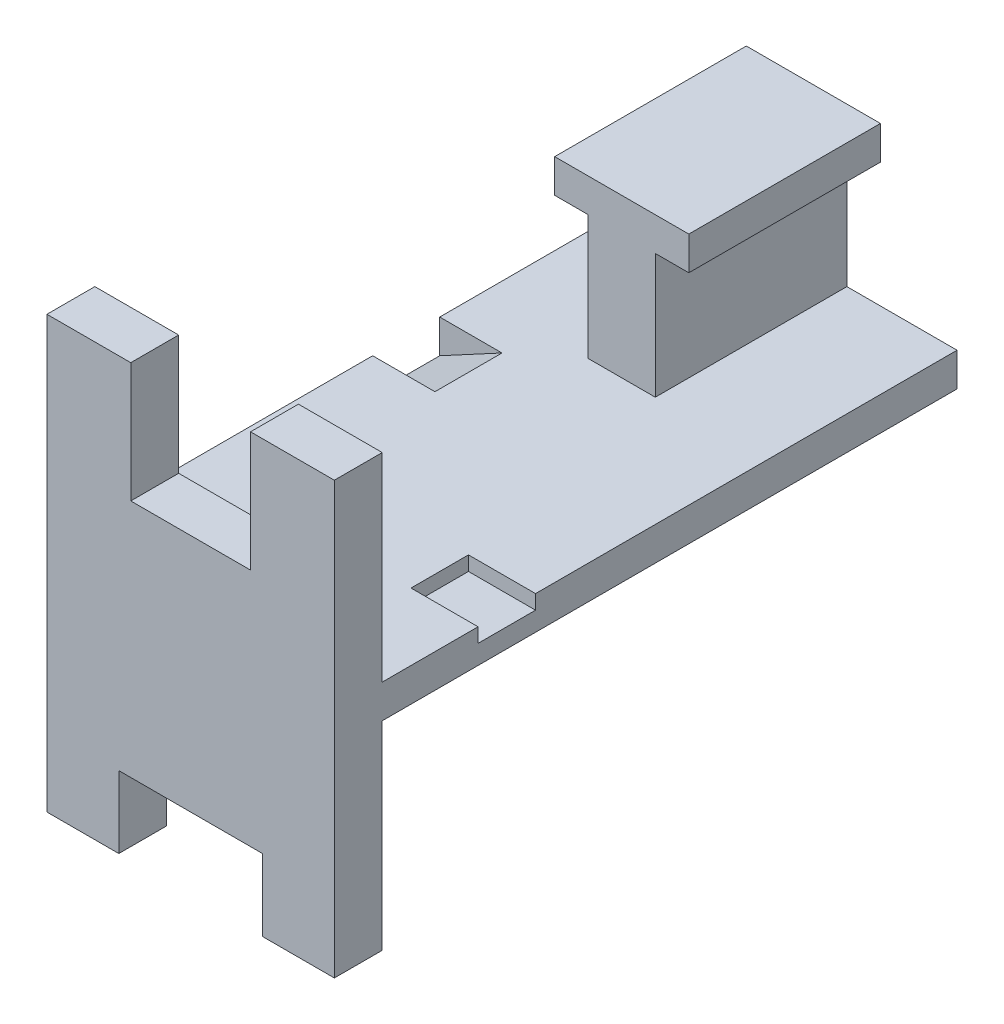
ISO-10303-21;
HEADER;
FILE_DESCRIPTION(('STEP AP214'),'2;1');
FILE_NAME('part.step','',(''),(''),'','','');
FILE_SCHEMA(('AUTOMOTIVE_DESIGN { 1 0 10303 214 1 1 1 1 }'));
ENDSEC;
DATA;
#1=APPLICATION_CONTEXT('core data for automotive mechanical design processes');
#2=APPLICATION_PROTOCOL_DEFINITION('international standard','automotive_design',2000,#1);
#3=PRODUCT_CONTEXT('',#1,'mechanical');
#4=PRODUCT('Part','Part','',(#3));
#5=PRODUCT_RELATED_PRODUCT_CATEGORY('part','',(#4));
#6=PRODUCT_DEFINITION_FORMATION('','',#4);
#7=PRODUCT_DEFINITION_CONTEXT('part definition',#1,'design');
#8=PRODUCT_DEFINITION('design','',#6,#7);
#9=PRODUCT_DEFINITION_SHAPE('','',#8);
#10=(LENGTH_UNIT() NAMED_UNIT(*) SI_UNIT(.MILLI.,.METRE.));
#11=(NAMED_UNIT(*) PLANE_ANGLE_UNIT() SI_UNIT($,.RADIAN.));
#12=(NAMED_UNIT(*) SI_UNIT($,.STERADIAN.) SOLID_ANGLE_UNIT());
#13=UNCERTAINTY_MEASURE_WITH_UNIT(LENGTH_MEASURE(1.E-05),#10,'distance_accuracy_value','');
#14=(GEOMETRIC_REPRESENTATION_CONTEXT(3) GLOBAL_UNCERTAINTY_ASSIGNED_CONTEXT((#13)) GLOBAL_UNIT_ASSIGNED_CONTEXT((#10,
#11,#12)) REPRESENTATION_CONTEXT('',''));
#15=CARTESIAN_POINT('',(0.,0.,0.));
#16=DIRECTION('',(0.,0.,1.));
#17=DIRECTION('',(1.,0.,0.));
#18=AXIS2_PLACEMENT_3D('',#15,#16,#17);
#19=CARTESIAN_POINT('',(0.,7.,120.));
#20=DIRECTION('',(0.,1.,0.));
#21=DIRECTION('',(0.,0.,1.));
#22=AXIS2_PLACEMENT_3D('',#19,#20,#21);
#23=PLANE('',#22);
#24=DIRECTION('',(0.,0.,-1.));
#25=VECTOR('',#24,1.);
#26=CARTESIAN_POINT('',(-17.,7.,62.));
#27=LINE('',#26,#25);
#28=CARTESIAN_POINT('',(-17.,7.,62.));
#29=VERTEX_POINT('',#28);
#30=CARTESIAN_POINT('',(-17.,7.,48.));
#31=VERTEX_POINT('',#30);
#32=EDGE_CURVE('E260',#29,#31,#27,.T.);
#33=ORIENTED_EDGE('',*,*,#32,.F.);
#34=DIRECTION('',(1.,0.,0.));
#35=VECTOR('',#34,1.);
#36=CARTESIAN_POINT('',(-17.,7.,62.));
#37=LINE('',#36,#35);
#38=CARTESIAN_POINT('',(-30.,6.99999999999999,62.));
#39=VERTEX_POINT('',#38);
#40=EDGE_CURVE('E247',#39,#29,#37,.T.);
#41=ORIENTED_EDGE('',*,*,#40,.F.);
#42=DIRECTION('',(0.,0.,-1.));
#43=VECTOR('',#42,1.);
#44=CARTESIAN_POINT('',(-30.,6.99999999999999,120.));
#45=LINE('',#44,#43);
#46=CARTESIAN_POINT('',(-30.,6.99999999999999,120.));
#47=VERTEX_POINT('',#46);
#48=EDGE_CURVE('E258',#47,#39,#45,.T.);
#49=ORIENTED_EDGE('',*,*,#48,.F.);
#50=DIRECTION('',(1.,0.,0.));
#51=VECTOR('',#50,1.);
#52=CARTESIAN_POINT('',(0.,7.,120.));
#53=LINE('',#52,#51);
#54=CARTESIAN_POINT('',(30.,7.,120.));
#55=VERTEX_POINT('',#54);
#56=EDGE_CURVE('E319',#47,#55,#53,.T.);
#57=ORIENTED_EDGE('',*,*,#56,.T.);
#58=DIRECTION('',(0.,0.,-1.));
#59=VECTOR('',#58,1.);
#60=CARTESIAN_POINT('',(30.,7.,120.));
#61=LINE('',#60,#59);
#62=CARTESIAN_POINT('',(30.,7.,100.));
#63=VERTEX_POINT('',#62);
#64=EDGE_CURVE('E276',#55,#63,#61,.T.);
#65=ORIENTED_EDGE('',*,*,#64,.T.);
#66=DIRECTION('',(1.,0.,0.));
#67=VECTOR('',#66,1.);
#68=CARTESIAN_POINT('',(30.,7.,100.));
#69=LINE('',#68,#67);
#70=CARTESIAN_POINT('',(16.,7.,100.));
#71=VERTEX_POINT('',#70);
#72=EDGE_CURVE('E717',#71,#63,#69,.T.);
#73=ORIENTED_EDGE('',*,*,#72,.F.);
#74=DIRECTION('',(0.,0.,1.));
#75=VECTOR('',#74,1.);
#76=CARTESIAN_POINT('',(16.,7.,100.));
#77=LINE('',#76,#75);
#78=CARTESIAN_POINT('',(16.,7.,88.));
#79=VERTEX_POINT('',#78);
#80=EDGE_CURVE('E720',#79,#71,#77,.T.);
#81=ORIENTED_EDGE('',*,*,#80,.F.);
#82=DIRECTION('',(-1.,0.,0.));
#83=VECTOR('',#82,1.);
#84=CARTESIAN_POINT('',(30.,7.,88.));
#85=LINE('',#84,#83);
#86=CARTESIAN_POINT('',(30.,7.,88.));
#87=VERTEX_POINT('',#86);
#88=EDGE_CURVE('E723',#87,#79,#85,.T.);
#89=ORIENTED_EDGE('',*,*,#88,.F.);
#90=CARTESIAN_POINT('',(30.,7.,0.));
#91=VERTEX_POINT('',#90);
#92=EDGE_CURVE('E281',#87,#91,#61,.T.);
#93=ORIENTED_EDGE('',*,*,#92,.T.);
#94=DIRECTION('',(1.,0.,0.));
#95=VECTOR('',#94,1.);
#96=CARTESIAN_POINT('',(0.,7.,0.));
#97=LINE('',#96,#95);
#98=CARTESIAN_POINT('',(7.,7.,0.));
#99=VERTEX_POINT('',#98);
#100=EDGE_CURVE('E342',#99,#91,#97,.T.);
#101=ORIENTED_EDGE('',*,*,#100,.F.);
#102=DIRECTION('',(0.,0.,-1.));
#103=VECTOR('',#102,1.);
#104=CARTESIAN_POINT('',(7.,7.,120.));
#105=LINE('',#104,#103);
#106=CARTESIAN_POINT('',(7.,7.00000000000001,40.));
#107=VERTEX_POINT('',#106);
#108=EDGE_CURVE('E285',#107,#99,#105,.T.);
#109=ORIENTED_EDGE('',*,*,#108,.F.);
#110=DIRECTION('',(1.,0.,0.));
#111=VECTOR('',#110,1.);
#112=CARTESIAN_POINT('',(0.,7.00000000000001,40.));
#113=LINE('',#112,#111);
#114=CARTESIAN_POINT('',(-7.,7.,40.));
#115=VERTEX_POINT('',#114);
#116=EDGE_CURVE('E304',#115,#107,#113,.T.);
#117=ORIENTED_EDGE('',*,*,#116,.F.);
#118=DIRECTION('',(0.,0.,-1.));
#119=VECTOR('',#118,1.);
#120=CARTESIAN_POINT('',(-7.,7.,120.));
#121=LINE('',#120,#119);
#122=CARTESIAN_POINT('',(-7.,7.,0.));
#123=VERTEX_POINT('',#122);
#124=EDGE_CURVE('E266',#115,#123,#121,.T.);
#125=ORIENTED_EDGE('',*,*,#124,.T.);
#126=DIRECTION('',(-1.,0.,0.));
#127=VECTOR('',#126,1.);
#128=CARTESIAN_POINT('',(0.,7.,0.));
#129=LINE('',#128,#127);
#130=CARTESIAN_POINT('',(-30.,6.99999999999999,0.));
#131=VERTEX_POINT('',#130);
#132=EDGE_CURVE('E468',#123,#131,#129,.T.);
#133=ORIENTED_EDGE('',*,*,#132,.T.);
#134=CARTESIAN_POINT('',(-30.,6.99999999999999,48.));
#135=VERTEX_POINT('',#134);
#136=EDGE_CURVE('E40',#135,#131,#45,.T.);
#137=ORIENTED_EDGE('',*,*,#136,.F.);
#138=DIRECTION('',(1.,0.,0.));
#139=VECTOR('',#138,1.);
#140=CARTESIAN_POINT('',(-17.,7.,48.));
#141=LINE('',#140,#139);
#142=EDGE_CURVE('E54',#135,#31,#141,.T.);
#143=ORIENTED_EDGE('',*,*,#142,.T.);
#144=EDGE_LOOP('',(#33,#41,#49,#57,#65,#73,#81,#89,#93,#101,#109,#117,#125,#133,#137,#143));
#145=FACE_BOUND('',#144,.T.);
#146=ADVANCED_FACE('F36',(#145),#23,.T.);
#147=CARTESIAN_POINT('',(-30.,0.,120.));
#148=DIRECTION('',(-1.,0.,0.));
#149=DIRECTION('',(0.,-1.,0.));
#150=AXIS2_PLACEMENT_3D('',#147,#148,#149);
#151=PLANE('',#150);
#152=ORIENTED_EDGE('',*,*,#48,.T.);
#153=DIRECTION('',(0.,1.,0.));
#154=VECTOR('',#153,1.);
#155=CARTESIAN_POINT('',(-30.,6.99999999999999,62.));
#156=LINE('',#155,#154);
#157=CARTESIAN_POINT('',(-30.,0.,62.));
#158=VERTEX_POINT('',#157);
#159=EDGE_CURVE('E244',#158,#39,#156,.T.);
#160=ORIENTED_EDGE('',*,*,#159,.F.);
#161=DIRECTION('',(0.,0.,-1.));
#162=VECTOR('',#161,1.);
#163=CARTESIAN_POINT('',(-30.,0.,120.));
#164=LINE('',#163,#162);
#165=CARTESIAN_POINT('',(-30.,0.,120.));
#166=VERTEX_POINT('',#165);
#167=EDGE_CURVE('E270',#166,#158,#164,.T.);
#168=ORIENTED_EDGE('',*,*,#167,.F.);
#169=DIRECTION('',(0.,1.,0.));
#170=VECTOR('',#169,1.);
#171=CARTESIAN_POINT('',(-30.,0.,120.));
#172=LINE('',#171,#170);
#173=CARTESIAN_POINT('',(-30.,-41.5,120.));
#174=VERTEX_POINT('',#173);
#175=EDGE_CURVE('E397',#174,#166,#172,.T.);
#176=ORIENTED_EDGE('',*,*,#175,.F.);
#177=DIRECTION('',(0.,0.,-1.));
#178=VECTOR('',#177,1.);
#179=CARTESIAN_POINT('',(-30.,-41.5,130.));
#180=LINE('',#179,#178);
#181=CARTESIAN_POINT('',(-30.,-41.5,130.));
#182=VERTEX_POINT('',#181);
#183=EDGE_CURVE('E425',#182,#174,#180,.T.);
#184=ORIENTED_EDGE('',*,*,#183,.F.);
#185=DIRECTION('',(0.,1.,0.));
#186=VECTOR('',#185,1.);
#187=CARTESIAN_POINT('',(-30.,0.,130.));
#188=LINE('',#187,#186);
#189=CARTESIAN_POINT('',(-30.,48.5,130.));
#190=VERTEX_POINT('',#189);
#191=EDGE_CURVE('E693',#182,#190,#188,.T.);
#192=ORIENTED_EDGE('',*,*,#191,.T.);
#193=DIRECTION('',(0.,0.,-1.));
#194=VECTOR('',#193,1.);
#195=CARTESIAN_POINT('',(-30.,48.5,130.));
#196=LINE('',#195,#194);
#197=CARTESIAN_POINT('',(-30.,48.5,120.));
#198=VERTEX_POINT('',#197);
#199=EDGE_CURVE('E427',#190,#198,#196,.T.);
#200=ORIENTED_EDGE('',*,*,#199,.T.);
#201=EDGE_CURVE('E265',#47,#198,#172,.T.);
#202=ORIENTED_EDGE('',*,*,#201,.F.);
#203=EDGE_LOOP('',(#152,#160,#168,#176,#184,#192,#200,#202));
#204=FACE_BOUND('',#203,.T.);
#205=ADVANCED_FACE('F263',(#204),#151,.T.);
#206=CARTESIAN_POINT('',(0.,40.,120.));
#207=DIRECTION('',(0.,1.,0.));
#208=DIRECTION('',(0.,0.,1.));
#209=AXIS2_PLACEMENT_3D('',#206,#207,#208);
#210=PLANE('',#209);
#211=DIRECTION('',(0.,0.,-1.));
#212=VECTOR('',#211,1.);
#213=CARTESIAN_POINT('',(-14.,40.,120.));
#214=LINE('',#213,#212);
#215=CARTESIAN_POINT('',(-14.,40.,40.));
#216=VERTEX_POINT('',#215);
#217=CARTESIAN_POINT('',(-14.,40.,0.));
#218=VERTEX_POINT('',#217);
#219=EDGE_CURVE('E287',#216,#218,#214,.T.);
#220=ORIENTED_EDGE('',*,*,#219,.F.);
#221=DIRECTION('',(-1.,0.,0.));
#222=VECTOR('',#221,1.);
#223=CARTESIAN_POINT('',(0.,40.,40.));
#224=LINE('',#223,#222);
#225=CARTESIAN_POINT('',(14.,40.,40.));
#226=VERTEX_POINT('',#225);
#227=EDGE_CURVE('E303',#226,#216,#224,.T.);
#228=ORIENTED_EDGE('',*,*,#227,.F.);
#229=DIRECTION('',(0.,0.,-1.));
#230=VECTOR('',#229,1.);
#231=CARTESIAN_POINT('',(14.,40.,120.));
#232=LINE('',#231,#230);
#233=CARTESIAN_POINT('',(14.,40.,0.));
#234=VERTEX_POINT('',#233);
#235=EDGE_CURVE('E324',#226,#234,#232,.T.);
#236=ORIENTED_EDGE('',*,*,#235,.T.);
#237=DIRECTION('',(1.,0.,0.));
#238=VECTOR('',#237,1.);
#239=CARTESIAN_POINT('',(0.,40.,0.));
#240=LINE('',#239,#238);
#241=EDGE_CURVE('E350',#218,#234,#240,.T.);
#242=ORIENTED_EDGE('',*,*,#241,.F.);
#243=EDGE_LOOP('',(#220,#228,#236,#242));
#244=FACE_BOUND('',#243,.T.);
#245=ADVANCED_FACE('F369',(#244),#210,.T.);
#246=CARTESIAN_POINT('',(0.,33.,120.));
#247=DIRECTION('',(0.,-1.,0.));
#248=DIRECTION('',(1.,0.,0.));
#249=AXIS2_PLACEMENT_3D('',#246,#247,#248);
#250=PLANE('',#249);
#251=DIRECTION('',(0.,0.,-1.));
#252=VECTOR('',#251,1.);
#253=CARTESIAN_POINT('',(-7.00000000000001,33.,120.));
#254=LINE('',#253,#252);
#255=CARTESIAN_POINT('',(-7.00000000000001,33.,40.));
#256=VERTEX_POINT('',#255);
#257=CARTESIAN_POINT('',(-7.00000000000001,33.,0.));
#258=VERTEX_POINT('',#257);
#259=EDGE_CURVE('E268',#256,#258,#254,.T.);
#260=ORIENTED_EDGE('',*,*,#259,.F.);
#261=DIRECTION('',(-1.,0.,0.));
#262=VECTOR('',#261,1.);
#263=CARTESIAN_POINT('',(0.,33.,40.));
#264=LINE('',#263,#262);
#265=CARTESIAN_POINT('',(-14.,33.,40.));
#266=VERTEX_POINT('',#265);
#267=EDGE_CURVE('E452',#256,#266,#264,.T.);
#268=ORIENTED_EDGE('',*,*,#267,.T.);
#269=DIRECTION('',(0.,0.,-1.));
#270=VECTOR('',#269,1.);
#271=CARTESIAN_POINT('',(-14.,33.,120.));
#272=LINE('',#271,#270);
#273=CARTESIAN_POINT('',(-14.,33.,0.));
#274=VERTEX_POINT('',#273);
#275=EDGE_CURVE('E292',#266,#274,#272,.T.);
#276=ORIENTED_EDGE('',*,*,#275,.T.);
#277=DIRECTION('',(-1.,0.,0.));
#278=VECTOR('',#277,1.);
#279=CARTESIAN_POINT('',(0.,33.,0.));
#280=LINE('',#279,#278);
#281=EDGE_CURVE('E458',#258,#274,#280,.T.);
#282=ORIENTED_EDGE('',*,*,#281,.F.);
#283=EDGE_LOOP('',(#260,#268,#276,#282));
#284=FACE_BOUND('',#283,.T.);
#285=ADVANCED_FACE('F483',(#284),#250,.T.);
#286=CARTESIAN_POINT('',(-7.,0.,120.));
#287=DIRECTION('',(-1.,0.,0.));
#288=DIRECTION('',(0.,-1.,0.));
#289=AXIS2_PLACEMENT_3D('',#286,#287,#288);
#290=PLANE('',#289);
#291=ORIENTED_EDGE('',*,*,#124,.F.);
#292=DIRECTION('',(0.,1.,0.));
#293=VECTOR('',#292,1.);
#294=CARTESIAN_POINT('',(-7.,0.,40.));
#295=LINE('',#294,#293);
#296=EDGE_CURVE('E447',#115,#256,#295,.T.);
#297=ORIENTED_EDGE('',*,*,#296,.T.);
#298=ORIENTED_EDGE('',*,*,#259,.T.);
#299=DIRECTION('',(0.,1.,0.));
#300=VECTOR('',#299,1.);
#301=CARTESIAN_POINT('',(-7.,0.,0.));
#302=LINE('',#301,#300);
#303=EDGE_CURVE('E465',#123,#258,#302,.T.);
#304=ORIENTED_EDGE('',*,*,#303,.F.);
#305=EDGE_LOOP('',(#291,#297,#298,#304));
#306=FACE_BOUND('',#305,.T.);
#307=ADVANCED_FACE('F478',(#306),#290,.T.);
#308=CARTESIAN_POINT('',(-14.,0.,120.));
#309=DIRECTION('',(-1.,0.,0.));
#310=DIRECTION('',(0.,-1.,0.));
#311=AXIS2_PLACEMENT_3D('',#308,#309,#310);
#312=PLANE('',#311);
#313=ORIENTED_EDGE('',*,*,#275,.F.);
#314=DIRECTION('',(0.,1.,0.));
#315=VECTOR('',#314,1.);
#316=CARTESIAN_POINT('',(-14.,0.,40.));
#317=LINE('',#316,#315);
#318=EDGE_CURVE('E11',#266,#216,#317,.T.);
#319=ORIENTED_EDGE('',*,*,#318,.T.);
#320=ORIENTED_EDGE('',*,*,#219,.T.);
#321=DIRECTION('',(0.,1.,0.));
#322=VECTOR('',#321,1.);
#323=CARTESIAN_POINT('',(-14.,0.,0.));
#324=LINE('',#323,#322);
#325=EDGE_CURVE('E298',#274,#218,#324,.T.);
#326=ORIENTED_EDGE('',*,*,#325,.F.);
#327=EDGE_LOOP('',(#313,#319,#320,#326));
#328=FACE_BOUND('',#327,.T.);
#329=ADVANCED_FACE('F482',(#328),#312,.T.);
#330=CARTESIAN_POINT('',(0.,33.,120.));
#331=DIRECTION('',(0.,1.,0.));
#332=DIRECTION('',(0.,0.,1.));
#333=AXIS2_PLACEMENT_3D('',#330,#331,#332);
#334=PLANE('',#333);
#335=DIRECTION('',(0.,0.,-1.));
#336=VECTOR('',#335,1.);
#337=CARTESIAN_POINT('',(14.,33.,120.));
#338=LINE('',#337,#336);
#339=CARTESIAN_POINT('',(14.,33.,40.));
#340=VERTEX_POINT('',#339);
#341=CARTESIAN_POINT('',(14.,33.,0.));
#342=VERTEX_POINT('',#341);
#343=EDGE_CURVE('E335',#340,#342,#338,.T.);
#344=ORIENTED_EDGE('',*,*,#343,.F.);
#345=DIRECTION('',(-1.,0.,0.));
#346=VECTOR('',#345,1.);
#347=CARTESIAN_POINT('',(0.,33.,40.));
#348=LINE('',#347,#346);
#349=CARTESIAN_POINT('',(7.,33.,40.));
#350=VERTEX_POINT('',#349);
#351=EDGE_CURVE('E306',#340,#350,#348,.T.);
#352=ORIENTED_EDGE('',*,*,#351,.T.);
#353=DIRECTION('',(0.,0.,-1.));
#354=VECTOR('',#353,1.);
#355=CARTESIAN_POINT('',(7.,33.,120.));
#356=LINE('',#355,#354);
#357=CARTESIAN_POINT('',(7.,33.,0.));
#358=VERTEX_POINT('',#357);
#359=EDGE_CURVE('E332',#350,#358,#356,.T.);
#360=ORIENTED_EDGE('',*,*,#359,.T.);
#361=DIRECTION('',(1.,0.,0.));
#362=VECTOR('',#361,1.);
#363=CARTESIAN_POINT('',(0.,33.,0.));
#364=LINE('',#363,#362);
#365=EDGE_CURVE('E311',#358,#342,#364,.T.);
#366=ORIENTED_EDGE('',*,*,#365,.T.);
#367=EDGE_LOOP('',(#344,#352,#360,#366));
#368=FACE_BOUND('',#367,.T.);
#369=ADVANCED_FACE('F38',(#368),#334,.F.);
#370=CARTESIAN_POINT('',(14.,0.,120.));
#371=DIRECTION('',(-1.,0.,0.));
#372=DIRECTION('',(0.,0.,1.));
#373=AXIS2_PLACEMENT_3D('',#370,#371,#372);
#374=PLANE('',#373);
#375=ORIENTED_EDGE('',*,*,#235,.F.);
#376=DIRECTION('',(0.,1.,0.));
#377=VECTOR('',#376,1.);
#378=CARTESIAN_POINT('',(14.,-74.2157620169878,40.));
#379=LINE('',#378,#377);
#380=EDGE_CURVE('E307',#340,#226,#379,.T.);
#381=ORIENTED_EDGE('',*,*,#380,.F.);
#382=ORIENTED_EDGE('',*,*,#343,.T.);
#383=DIRECTION('',(0.,1.,0.));
#384=VECTOR('',#383,1.);
#385=CARTESIAN_POINT('',(14.,0.,0.));
#386=LINE('',#385,#384);
#387=EDGE_CURVE('E352',#342,#234,#386,.T.);
#388=ORIENTED_EDGE('',*,*,#387,.T.);
#389=EDGE_LOOP('',(#375,#381,#382,#388));
#390=FACE_BOUND('',#389,.T.);
#391=ADVANCED_FACE('F372',(#390),#374,.F.);
#392=CARTESIAN_POINT('',(0.,0.,120.));
#393=DIRECTION('',(0.,1.,0.));
#394=DIRECTION('',(0.,0.,1.));
#395=AXIS2_PLACEMENT_3D('',#392,#393,#394);
#396=PLANE('',#395);
#397=DIRECTION('',(1.,0.,0.));
#398=VECTOR('',#397,1.);
#399=CARTESIAN_POINT('',(0.,0.,0.));
#400=LINE('',#399,#398);
#401=CARTESIAN_POINT('',(-30.,0.,0.));
#402=VERTEX_POINT('',#401);
#403=CARTESIAN_POINT('',(30.,0.,0.));
#404=VERTEX_POINT('',#403);
#405=EDGE_CURVE('E348',#402,#404,#400,.T.);
#406=ORIENTED_EDGE('',*,*,#405,.T.);
#407=DIRECTION('',(0.,0.,-1.));
#408=VECTOR('',#407,1.);
#409=CARTESIAN_POINT('',(30.,0.,120.));
#410=LINE('',#409,#408);
#411=CARTESIAN_POINT('',(30.,0.,120.));
#412=VERTEX_POINT('',#411);
#413=EDGE_CURVE('E280',#412,#404,#410,.T.);
#414=ORIENTED_EDGE('',*,*,#413,.F.);
#415=DIRECTION('',(1.,0.,0.));
#416=VECTOR('',#415,1.);
#417=CARTESIAN_POINT('',(0.,0.,120.));
#418=LINE('',#417,#416);
#419=EDGE_CURVE('E316',#166,#412,#418,.T.);
#420=ORIENTED_EDGE('',*,*,#419,.F.);
#421=ORIENTED_EDGE('',*,*,#167,.T.);
#422=DIRECTION('',(0.,0.,-1.));
#423=VECTOR('',#422,1.);
#424=CARTESIAN_POINT('',(-30.,0.,62.));
#425=LINE('',#424,#423);
#426=CARTESIAN_POINT('',(-30.,0.,48.));
#427=VERTEX_POINT('',#426);
#428=EDGE_CURVE('E725',#158,#427,#425,.T.);
#429=ORIENTED_EDGE('',*,*,#428,.T.);
#430=EDGE_CURVE('E286',#427,#402,#164,.T.);
#431=ORIENTED_EDGE('',*,*,#430,.T.);
#432=EDGE_LOOP('',(#406,#414,#420,#421,#429,#431));
#433=FACE_BOUND('',#432,.T.);
#434=ADVANCED_FACE('F390',(#433),#396,.F.);
#435=CARTESIAN_POINT('',(30.,0.,120.));
#436=DIRECTION('',(-1.,0.,0.));
#437=DIRECTION('',(0.,-1.,0.));
#438=AXIS2_PLACEMENT_3D('',#435,#436,#437);
#439=PLANE('',#438);
#440=DIRECTION('',(0.,0.,-1.));
#441=VECTOR('',#440,1.);
#442=CARTESIAN_POINT('',(30.,4.,100.));
#443=LINE('',#442,#441);
#444=CARTESIAN_POINT('',(30.,4.,100.));
#445=VERTEX_POINT('',#444);
#446=CARTESIAN_POINT('',(30.,4.,88.));
#447=VERTEX_POINT('',#446);
#448=EDGE_CURVE('E719',#445,#447,#443,.T.);
#449=ORIENTED_EDGE('',*,*,#448,.F.);
#450=DIRECTION('',(0.,1.,0.));
#451=VECTOR('',#450,1.);
#452=CARTESIAN_POINT('',(30.,4.,100.));
#453=LINE('',#452,#451);
#454=EDGE_CURVE('E646',#445,#63,#453,.T.);
#455=ORIENTED_EDGE('',*,*,#454,.T.);
#456=ORIENTED_EDGE('',*,*,#64,.F.);
#457=DIRECTION('',(0.,1.,0.));
#458=VECTOR('',#457,1.);
#459=CARTESIAN_POINT('',(30.,0.,120.));
#460=LINE('',#459,#458);
#461=CARTESIAN_POINT('',(30.,48.5,120.));
#462=VERTEX_POINT('',#461);
#463=EDGE_CURVE('E461',#55,#462,#460,.T.);
#464=ORIENTED_EDGE('',*,*,#463,.T.);
#465=DIRECTION('',(0.,0.,-1.));
#466=VECTOR('',#465,1.);
#467=CARTESIAN_POINT('',(30.,48.5,130.));
#468=LINE('',#467,#466);
#469=CARTESIAN_POINT('',(30.,48.5,130.));
#470=VERTEX_POINT('',#469);
#471=EDGE_CURVE('E437',#470,#462,#468,.T.);
#472=ORIENTED_EDGE('',*,*,#471,.F.);
#473=DIRECTION('',(0.,1.,0.));
#474=VECTOR('',#473,1.);
#475=CARTESIAN_POINT('',(30.,0.,130.));
#476=LINE('',#475,#474);
#477=CARTESIAN_POINT('',(30.,-41.5,130.));
#478=VERTEX_POINT('',#477);
#479=EDGE_CURVE('E705',#478,#470,#476,.T.);
#480=ORIENTED_EDGE('',*,*,#479,.F.);
#481=DIRECTION('',(0.,0.,-1.));
#482=VECTOR('',#481,1.);
#483=CARTESIAN_POINT('',(30.,-41.5,130.));
#484=LINE('',#483,#482);
#485=CARTESIAN_POINT('',(30.,-41.5,120.));
#486=VERTEX_POINT('',#485);
#487=EDGE_CURVE('E440',#478,#486,#484,.T.);
#488=ORIENTED_EDGE('',*,*,#487,.T.);
#489=EDGE_CURVE('E389',#486,#412,#460,.T.);
#490=ORIENTED_EDGE('',*,*,#489,.T.);
#491=ORIENTED_EDGE('',*,*,#413,.T.);
#492=DIRECTION('',(0.,1.,0.));
#493=VECTOR('',#492,1.);
#494=CARTESIAN_POINT('',(30.,0.,0.));
#495=LINE('',#494,#493);
#496=EDGE_CURVE('E345',#404,#91,#495,.T.);
#497=ORIENTED_EDGE('',*,*,#496,.T.);
#498=ORIENTED_EDGE('',*,*,#92,.F.);
#499=DIRECTION('',(0.,1.,0.));
#500=VECTOR('',#499,1.);
#501=CARTESIAN_POINT('',(30.,4.,88.));
#502=LINE('',#501,#500);
#503=EDGE_CURVE('E62',#447,#87,#502,.T.);
#504=ORIENTED_EDGE('',*,*,#503,.F.);
#505=EDGE_LOOP('',(#449,#455,#456,#464,#472,#480,#488,#490,#491,#497,#498,#504));
#506=FACE_BOUND('',#505,.T.);
#507=ADVANCED_FACE('F385',(#506),#439,.F.);
#508=CARTESIAN_POINT('',(7.,0.,120.));
#509=DIRECTION('',(-1.,0.,0.));
#510=DIRECTION('',(0.,0.,1.));
#511=AXIS2_PLACEMENT_3D('',#508,#509,#510);
#512=PLANE('',#511);
#513=ORIENTED_EDGE('',*,*,#359,.F.);
#514=DIRECTION('',(0.,-1.,0.));
#515=VECTOR('',#514,1.);
#516=CARTESIAN_POINT('',(7.,0.,40.));
#517=LINE('',#516,#515);
#518=EDGE_CURVE('E46',#350,#107,#517,.T.);
#519=ORIENTED_EDGE('',*,*,#518,.T.);
#520=ORIENTED_EDGE('',*,*,#108,.T.);
#521=DIRECTION('',(0.,1.,0.));
#522=VECTOR('',#521,1.);
#523=CARTESIAN_POINT('',(7.,0.,0.));
#524=LINE('',#523,#522);
#525=EDGE_CURVE('E320',#99,#358,#524,.T.);
#526=ORIENTED_EDGE('',*,*,#525,.T.);
#527=EDGE_LOOP('',(#513,#519,#520,#526));
#528=FACE_BOUND('',#527,.T.);
#529=ADVANCED_FACE('F376',(#528),#512,.F.);
#530=CARTESIAN_POINT('',(0.,0.,0.));
#531=DIRECTION('',(0.,0.,1.));
#532=DIRECTION('',(1.,0.,0.));
#533=AXIS2_PLACEMENT_3D('',#530,#531,#532);
#534=PLANE('',#533);
#535=ORIENTED_EDGE('',*,*,#365,.F.);
#536=ORIENTED_EDGE('',*,*,#525,.F.);
#537=ORIENTED_EDGE('',*,*,#100,.T.);
#538=ORIENTED_EDGE('',*,*,#496,.F.);
#539=ORIENTED_EDGE('',*,*,#405,.F.);
#540=DIRECTION('',(0.,1.,0.));
#541=VECTOR('',#540,1.);
#542=CARTESIAN_POINT('',(-30.,0.,0.));
#543=LINE('',#542,#541);
#544=EDGE_CURVE('E471',#402,#131,#543,.T.);
#545=ORIENTED_EDGE('',*,*,#544,.T.);
#546=ORIENTED_EDGE('',*,*,#132,.F.);
#547=ORIENTED_EDGE('',*,*,#303,.T.);
#548=ORIENTED_EDGE('',*,*,#281,.T.);
#549=ORIENTED_EDGE('',*,*,#325,.T.);
#550=ORIENTED_EDGE('',*,*,#241,.T.);
#551=ORIENTED_EDGE('',*,*,#387,.F.);
#552=EDGE_LOOP('',(#535,#536,#537,#538,#539,#545,#546,#547,#548,#549,#550,#551));
#553=FACE_BOUND('',#552,.T.);
#554=ADVANCED_FACE('F364',(#553),#534,.F.);
#555=CARTESIAN_POINT('',(0.,-74.2157620169878,40.));
#556=DIRECTION('',(0.,0.,-1.));
#557=DIRECTION('',(-1.,0.,0.));
#558=AXIS2_PLACEMENT_3D('',#555,#556,#557);
#559=PLANE('',#558);
#560=ORIENTED_EDGE('',*,*,#380,.T.);
#561=ORIENTED_EDGE('',*,*,#227,.T.);
#562=ORIENTED_EDGE('',*,*,#318,.F.);
#563=ORIENTED_EDGE('',*,*,#267,.F.);
#564=ORIENTED_EDGE('',*,*,#296,.F.);
#565=ORIENTED_EDGE('',*,*,#116,.T.);
#566=ORIENTED_EDGE('',*,*,#518,.F.);
#567=ORIENTED_EDGE('',*,*,#351,.F.);
#568=EDGE_LOOP('',(#560,#561,#562,#563,#564,#565,#566,#567));
#569=FACE_BOUND('',#568,.T.);
#570=ADVANCED_FACE('F374',(#569),#559,.F.);
#571=DIRECTION('',(0.,1.,0.));
#572=VECTOR('',#571,1.);
#573=CARTESIAN_POINT('',(-30.,6.99999999999999,48.));
#574=LINE('',#573,#572);
#575=EDGE_CURVE('E477',#427,#135,#574,.T.);
#576=ORIENTED_EDGE('',*,*,#575,.T.);
#577=ORIENTED_EDGE('',*,*,#136,.T.);
#578=ORIENTED_EDGE('',*,*,#544,.F.);
#579=ORIENTED_EDGE('',*,*,#430,.F.);
#580=EDGE_LOOP('',(#576,#577,#578,#579));
#581=FACE_BOUND('',#580,.T.);
#582=ADVANCED_FACE('F475',(#581),#151,.T.);
#583=CARTESIAN_POINT('',(0.,0.,120.));
#584=DIRECTION('',(0.,0.,1.));
#585=DIRECTION('',(1.,0.,0.));
#586=AXIS2_PLACEMENT_3D('',#583,#584,#585);
#587=PLANE('',#586);
#588=ORIENTED_EDGE('',*,*,#175,.T.);
#589=ORIENTED_EDGE('',*,*,#419,.T.);
#590=ORIENTED_EDGE('',*,*,#489,.F.);
#591=DIRECTION('',(1.,0.,0.));
#592=VECTOR('',#591,1.);
#593=CARTESIAN_POINT('',(0.,-41.5,120.));
#594=LINE('',#593,#592);
#595=CARTESIAN_POINT('',(15.,-41.5,120.));
#596=VERTEX_POINT('',#595);
#597=EDGE_CURVE('E404',#596,#486,#594,.T.);
#598=ORIENTED_EDGE('',*,*,#597,.F.);
#599=DIRECTION('',(0.,-1.,0.));
#600=VECTOR('',#599,1.);
#601=CARTESIAN_POINT('',(15.,0.,120.));
#602=LINE('',#601,#600);
#603=CARTESIAN_POINT('',(15.,-26.5,120.));
#604=VERTEX_POINT('',#603);
#605=EDGE_CURVE('E642',#604,#596,#602,.T.);
#606=ORIENTED_EDGE('',*,*,#605,.F.);
#607=DIRECTION('',(1.,0.,0.));
#608=VECTOR('',#607,1.);
#609=CARTESIAN_POINT('',(0.,-26.5,120.));
#610=LINE('',#609,#608);
#611=CARTESIAN_POINT('',(-15.,-26.5,120.));
#612=VERTEX_POINT('',#611);
#613=EDGE_CURVE('E644',#612,#604,#610,.T.);
#614=ORIENTED_EDGE('',*,*,#613,.F.);
#615=DIRECTION('',(0.,-1.,0.));
#616=VECTOR('',#615,1.);
#617=CARTESIAN_POINT('',(-15.,0.,120.));
#618=LINE('',#617,#616);
#619=CARTESIAN_POINT('',(-15.,-41.5,120.));
#620=VERTEX_POINT('',#619);
#621=EDGE_CURVE('E402',#612,#620,#618,.T.);
#622=ORIENTED_EDGE('',*,*,#621,.T.);
#623=EDGE_CURVE('E400',#174,#620,#594,.T.);
#624=ORIENTED_EDGE('',*,*,#623,.F.);
#625=EDGE_LOOP('',(#588,#589,#590,#598,#606,#614,#622,#624));
#626=FACE_BOUND('',#625,.T.);
#627=ADVANCED_FACE('F393',(#626),#587,.F.);
#628=CARTESIAN_POINT('',(0.,-26.5,130.));
#629=DIRECTION('',(0.,1.,0.));
#630=DIRECTION('',(0.,0.,1.));
#631=AXIS2_PLACEMENT_3D('',#628,#629,#630);
#632=PLANE('',#631);
#633=ORIENTED_EDGE('',*,*,#613,.T.);
#634=DIRECTION('',(0.,0.,-1.));
#635=VECTOR('',#634,1.);
#636=CARTESIAN_POINT('',(15.,-26.5,130.));
#637=LINE('',#636,#635);
#638=CARTESIAN_POINT('',(15.,-26.5,130.));
#639=VERTEX_POINT('',#638);
#640=EDGE_CURVE('E409',#639,#604,#637,.T.);
#641=ORIENTED_EDGE('',*,*,#640,.F.);
#642=DIRECTION('',(1.,0.,0.));
#643=VECTOR('',#642,1.);
#644=CARTESIAN_POINT('',(0.,-26.5,130.));
#645=LINE('',#644,#643);
#646=CARTESIAN_POINT('',(-15.,-26.5,130.));
#647=VERTEX_POINT('',#646);
#648=EDGE_CURVE('E419',#647,#639,#645,.T.);
#649=ORIENTED_EDGE('',*,*,#648,.F.);
#650=DIRECTION('',(0.,0.,-1.));
#651=VECTOR('',#650,1.);
#652=CARTESIAN_POINT('',(-15.,-26.5,130.));
#653=LINE('',#652,#651);
#654=EDGE_CURVE('E420',#647,#612,#653,.T.);
#655=ORIENTED_EDGE('',*,*,#654,.T.);
#656=EDGE_LOOP('',(#633,#641,#649,#655));
#657=FACE_BOUND('',#656,.T.);
#658=ADVANCED_FACE('F516',(#657),#632,.F.);
#659=CARTESIAN_POINT('',(15.,0.,130.));
#660=DIRECTION('',(1.,0.,0.));
#661=DIRECTION('',(0.,1.,0.));
#662=AXIS2_PLACEMENT_3D('',#659,#660,#661);
#663=PLANE('',#662);
#664=ORIENTED_EDGE('',*,*,#605,.T.);
#665=DIRECTION('',(0.,0.,-1.));
#666=VECTOR('',#665,1.);
#667=CARTESIAN_POINT('',(15.,-41.5,130.));
#668=LINE('',#667,#666);
#669=CARTESIAN_POINT('',(15.,-41.5,130.));
#670=VERTEX_POINT('',#669);
#671=EDGE_CURVE('E441',#670,#596,#668,.T.);
#672=ORIENTED_EDGE('',*,*,#671,.F.);
#673=DIRECTION('',(0.,-1.,0.));
#674=VECTOR('',#673,1.);
#675=CARTESIAN_POINT('',(15.,0.,130.));
#676=LINE('',#675,#674);
#677=EDGE_CURVE('E706',#639,#670,#676,.T.);
#678=ORIENTED_EDGE('',*,*,#677,.F.);
#679=ORIENTED_EDGE('',*,*,#640,.T.);
#680=EDGE_LOOP('',(#664,#672,#678,#679));
#681=FACE_BOUND('',#680,.T.);
#682=ADVANCED_FACE('F635',(#681),#663,.F.);
#683=CARTESIAN_POINT('',(0.,-41.5,130.));
#684=DIRECTION('',(0.,1.,0.));
#685=DIRECTION('',(-1.,0.,0.));
#686=AXIS2_PLACEMENT_3D('',#683,#684,#685);
#687=PLANE('',#686);
#688=ORIENTED_EDGE('',*,*,#597,.T.);
#689=ORIENTED_EDGE('',*,*,#487,.F.);
#690=DIRECTION('',(1.,0.,0.));
#691=VECTOR('',#690,1.);
#692=CARTESIAN_POINT('',(0.,-41.5,130.));
#693=LINE('',#692,#691);
#694=EDGE_CURVE('E699',#670,#478,#693,.T.);
#695=ORIENTED_EDGE('',*,*,#694,.F.);
#696=ORIENTED_EDGE('',*,*,#671,.T.);
#697=EDGE_LOOP('',(#688,#689,#695,#696));
#698=FACE_BOUND('',#697,.T.);
#699=ADVANCED_FACE('F619',(#698),#687,.F.);
#700=CARTESIAN_POINT('',(0.,48.5,130.));
#701=DIRECTION('',(0.,1.,0.));
#702=DIRECTION('',(0.,0.,1.));
#703=AXIS2_PLACEMENT_3D('',#700,#701,#702);
#704=PLANE('',#703);
#705=DIRECTION('',(1.,0.,0.));
#706=VECTOR('',#705,1.);
#707=CARTESIAN_POINT('',(0.,48.5,120.));
#708=LINE('',#707,#706);
#709=CARTESIAN_POINT('',(12.5,48.5,120.));
#710=VERTEX_POINT('',#709);
#711=EDGE_CURVE('E651',#710,#462,#708,.T.);
#712=ORIENTED_EDGE('',*,*,#711,.F.);
#713=DIRECTION('',(0.,0.,-1.));
#714=VECTOR('',#713,1.);
#715=CARTESIAN_POINT('',(12.5,48.5,130.));
#716=LINE('',#715,#714);
#717=CARTESIAN_POINT('',(12.5,48.5,130.));
#718=VERTEX_POINT('',#717);
#719=EDGE_CURVE('E435',#718,#710,#716,.T.);
#720=ORIENTED_EDGE('',*,*,#719,.F.);
#721=DIRECTION('',(1.,0.,0.));
#722=VECTOR('',#721,1.);
#723=CARTESIAN_POINT('',(0.,48.5,130.));
#724=LINE('',#723,#722);
#725=EDGE_CURVE('E666',#718,#470,#724,.T.);
#726=ORIENTED_EDGE('',*,*,#725,.T.);
#727=ORIENTED_EDGE('',*,*,#471,.T.);
#728=EDGE_LOOP('',(#712,#720,#726,#727));
#729=FACE_BOUND('',#728,.T.);
#730=ADVANCED_FACE('F624',(#729),#704,.T.);
#731=CARTESIAN_POINT('',(12.5,0.,130.));
#732=DIRECTION('',(-1.,0.,0.));
#733=DIRECTION('',(0.,0.,1.));
#734=AXIS2_PLACEMENT_3D('',#731,#732,#733);
#735=PLANE('',#734);
#736=DIRECTION('',(0.,1.,0.));
#737=VECTOR('',#736,1.);
#738=CARTESIAN_POINT('',(12.5,0.,120.));
#739=LINE('',#738,#737);
#740=CARTESIAN_POINT('',(12.5,23.5,120.));
#741=VERTEX_POINT('',#740);
#742=EDGE_CURVE('E655',#741,#710,#739,.T.);
#743=ORIENTED_EDGE('',*,*,#742,.F.);
#744=DIRECTION('',(0.,0.,-1.));
#745=VECTOR('',#744,1.);
#746=CARTESIAN_POINT('',(12.5,23.5,130.));
#747=LINE('',#746,#745);
#748=CARTESIAN_POINT('',(12.5,23.5,130.));
#749=VERTEX_POINT('',#748);
#750=EDGE_CURVE('E433',#749,#741,#747,.T.);
#751=ORIENTED_EDGE('',*,*,#750,.F.);
#752=DIRECTION('',(0.,1.,0.));
#753=VECTOR('',#752,1.);
#754=CARTESIAN_POINT('',(12.5,0.,130.));
#755=LINE('',#754,#753);
#756=EDGE_CURVE('E688',#749,#718,#755,.T.);
#757=ORIENTED_EDGE('',*,*,#756,.T.);
#758=ORIENTED_EDGE('',*,*,#719,.T.);
#759=EDGE_LOOP('',(#743,#751,#757,#758));
#760=FACE_BOUND('',#759,.T.);
#761=ADVANCED_FACE('F631',(#760),#735,.T.);
#762=CARTESIAN_POINT('',(0.,23.5,130.));
#763=DIRECTION('',(0.,1.,0.));
#764=DIRECTION('',(0.,0.,1.));
#765=AXIS2_PLACEMENT_3D('',#762,#763,#764);
#766=PLANE('',#765);
#767=DIRECTION('',(1.,0.,0.));
#768=VECTOR('',#767,1.);
#769=CARTESIAN_POINT('',(0.,23.5,120.));
#770=LINE('',#769,#768);
#771=CARTESIAN_POINT('',(-12.5,23.5,120.));
#772=VERTEX_POINT('',#771);
#773=EDGE_CURVE('E671',#772,#741,#770,.T.);
#774=ORIENTED_EDGE('',*,*,#773,.F.);
#775=DIRECTION('',(0.,0.,-1.));
#776=VECTOR('',#775,1.);
#777=CARTESIAN_POINT('',(-12.5,23.5,130.));
#778=LINE('',#777,#776);
#779=CARTESIAN_POINT('',(-12.5,23.5,130.));
#780=VERTEX_POINT('',#779);
#781=EDGE_CURVE('E431',#780,#772,#778,.T.);
#782=ORIENTED_EDGE('',*,*,#781,.F.);
#783=DIRECTION('',(1.,0.,0.));
#784=VECTOR('',#783,1.);
#785=CARTESIAN_POINT('',(0.,23.5,130.));
#786=LINE('',#785,#784);
#787=EDGE_CURVE('E682',#780,#749,#786,.T.);
#788=ORIENTED_EDGE('',*,*,#787,.T.);
#789=ORIENTED_EDGE('',*,*,#750,.T.);
#790=EDGE_LOOP('',(#774,#782,#788,#789));
#791=FACE_BOUND('',#790,.T.);
#792=ADVANCED_FACE('F627',(#791),#766,.T.);
#793=CARTESIAN_POINT('',(-12.5,0.,130.));
#794=DIRECTION('',(-1.,0.,0.));
#795=DIRECTION('',(0.,0.,1.));
#796=AXIS2_PLACEMENT_3D('',#793,#794,#795);
#797=PLANE('',#796);
#798=DIRECTION('',(0.,1.,0.));
#799=VECTOR('',#798,1.);
#800=CARTESIAN_POINT('',(-12.5,0.,120.));
#801=LINE('',#800,#799);
#802=CARTESIAN_POINT('',(-12.5,48.5,120.));
#803=VERTEX_POINT('',#802);
#804=EDGE_CURVE('E415',#772,#803,#801,.T.);
#805=ORIENTED_EDGE('',*,*,#804,.T.);
#806=DIRECTION('',(0.,0.,-1.));
#807=VECTOR('',#806,1.);
#808=CARTESIAN_POINT('',(-12.5,48.5,130.));
#809=LINE('',#808,#807);
#810=CARTESIAN_POINT('',(-12.5,48.5,130.));
#811=VERTEX_POINT('',#810);
#812=EDGE_CURVE('E429',#811,#803,#809,.T.);
#813=ORIENTED_EDGE('',*,*,#812,.F.);
#814=DIRECTION('',(0.,1.,0.));
#815=VECTOR('',#814,1.);
#816=CARTESIAN_POINT('',(-12.5,0.,130.));
#817=LINE('',#816,#815);
#818=EDGE_CURVE('E680',#780,#811,#817,.T.);
#819=ORIENTED_EDGE('',*,*,#818,.F.);
#820=ORIENTED_EDGE('',*,*,#781,.T.);
#821=EDGE_LOOP('',(#805,#813,#819,#820));
#822=FACE_BOUND('',#821,.T.);
#823=ADVANCED_FACE('F622',(#822),#797,.F.);
#824=EDGE_CURVE('E405',#198,#803,#708,.T.);
#825=ORIENTED_EDGE('',*,*,#824,.F.);
#826=ORIENTED_EDGE('',*,*,#199,.F.);
#827=EDGE_CURVE('E678',#190,#811,#724,.T.);
#828=ORIENTED_EDGE('',*,*,#827,.T.);
#829=ORIENTED_EDGE('',*,*,#812,.T.);
#830=EDGE_LOOP('',(#825,#826,#828,#829));
#831=FACE_BOUND('',#830,.T.);
#832=ADVANCED_FACE('F617',(#831),#704,.T.);
#833=ORIENTED_EDGE('',*,*,#623,.T.);
#834=DIRECTION('',(0.,0.,-1.));
#835=VECTOR('',#834,1.);
#836=CARTESIAN_POINT('',(-15.,-41.5,130.));
#837=LINE('',#836,#835);
#838=CARTESIAN_POINT('',(-15.,-41.5,130.));
#839=VERTEX_POINT('',#838);
#840=EDGE_CURVE('E422',#839,#620,#837,.T.);
#841=ORIENTED_EDGE('',*,*,#840,.F.);
#842=EDGE_CURVE('E695',#182,#839,#693,.T.);
#843=ORIENTED_EDGE('',*,*,#842,.F.);
#844=ORIENTED_EDGE('',*,*,#183,.T.);
#845=EDGE_LOOP('',(#833,#841,#843,#844));
#846=FACE_BOUND('',#845,.T.);
#847=ADVANCED_FACE('F613',(#846),#687,.F.);
#848=CARTESIAN_POINT('',(-15.,0.,130.));
#849=DIRECTION('',(1.,0.,0.));
#850=DIRECTION('',(0.,1.,0.));
#851=AXIS2_PLACEMENT_3D('',#848,#849,#850);
#852=PLANE('',#851);
#853=ORIENTED_EDGE('',*,*,#621,.F.);
#854=ORIENTED_EDGE('',*,*,#654,.F.);
#855=DIRECTION('',(0.,-1.,0.));
#856=VECTOR('',#855,1.);
#857=CARTESIAN_POINT('',(-15.,0.,130.));
#858=LINE('',#857,#856);
#859=EDGE_CURVE('E423',#647,#839,#858,.T.);
#860=ORIENTED_EDGE('',*,*,#859,.T.);
#861=ORIENTED_EDGE('',*,*,#840,.T.);
#862=EDGE_LOOP('',(#853,#854,#860,#861));
#863=FACE_BOUND('',#862,.T.);
#864=ADVANCED_FACE('F606',(#863),#852,.T.);
#865=CARTESIAN_POINT('',(0.,0.,130.));
#866=DIRECTION('',(0.,0.,1.));
#867=DIRECTION('',(1.,0.,0.));
#868=AXIS2_PLACEMENT_3D('',#865,#866,#867);
#869=PLANE('',#868);
#870=ORIENTED_EDGE('',*,*,#648,.T.);
#871=ORIENTED_EDGE('',*,*,#677,.T.);
#872=ORIENTED_EDGE('',*,*,#694,.T.);
#873=ORIENTED_EDGE('',*,*,#479,.T.);
#874=ORIENTED_EDGE('',*,*,#725,.F.);
#875=ORIENTED_EDGE('',*,*,#756,.F.);
#876=ORIENTED_EDGE('',*,*,#787,.F.);
#877=ORIENTED_EDGE('',*,*,#818,.T.);
#878=ORIENTED_EDGE('',*,*,#827,.F.);
#879=ORIENTED_EDGE('',*,*,#191,.F.);
#880=ORIENTED_EDGE('',*,*,#842,.T.);
#881=ORIENTED_EDGE('',*,*,#859,.F.);
#882=EDGE_LOOP('',(#870,#871,#872,#873,#874,#875,#876,#877,#878,#879,#880,#881));
#883=FACE_BOUND('',#882,.T.);
#884=ADVANCED_FACE('F604',(#883),#869,.T.);
#885=ORIENTED_EDGE('',*,*,#56,.F.);
#886=ORIENTED_EDGE('',*,*,#201,.T.);
#887=ORIENTED_EDGE('',*,*,#824,.T.);
#888=ORIENTED_EDGE('',*,*,#804,.F.);
#889=ORIENTED_EDGE('',*,*,#773,.T.);
#890=ORIENTED_EDGE('',*,*,#742,.T.);
#891=ORIENTED_EDGE('',*,*,#711,.T.);
#892=ORIENTED_EDGE('',*,*,#463,.F.);
#893=EDGE_LOOP('',(#885,#886,#887,#888,#889,#890,#891,#892));
#894=FACE_BOUND('',#893,.T.);
#895=ADVANCED_FACE('F524',(#894),#587,.F.);
#896=CARTESIAN_POINT('',(30.,4.,100.));
#897=DIRECTION('',(0.,0.,1.));
#898=DIRECTION('',(1.,0.,0.));
#899=AXIS2_PLACEMENT_3D('',#896,#897,#898);
#900=PLANE('',#899);
#901=ORIENTED_EDGE('',*,*,#72,.T.);
#902=ORIENTED_EDGE('',*,*,#454,.F.);
#903=DIRECTION('',(1.,0.,0.));
#904=VECTOR('',#903,1.);
#905=CARTESIAN_POINT('',(30.,4.,100.));
#906=LINE('',#905,#904);
#907=CARTESIAN_POINT('',(16.,4.,100.));
#908=VERTEX_POINT('',#907);
#909=EDGE_CURVE('E712',#908,#445,#906,.T.);
#910=ORIENTED_EDGE('',*,*,#909,.F.);
#911=DIRECTION('',(0.,1.,0.));
#912=VECTOR('',#911,1.);
#913=CARTESIAN_POINT('',(16.,4.,100.));
#914=LINE('',#913,#912);
#915=EDGE_CURVE('E714',#908,#71,#914,.T.);
#916=ORIENTED_EDGE('',*,*,#915,.T.);
#917=EDGE_LOOP('',(#901,#902,#910,#916));
#918=FACE_BOUND('',#917,.T.);
#919=ADVANCED_FACE('F594',(#918),#900,.F.);
#920=CARTESIAN_POINT('',(16.,4.,100.));
#921=DIRECTION('',(-1.,0.,0.));
#922=DIRECTION('',(0.,0.,1.));
#923=AXIS2_PLACEMENT_3D('',#920,#921,#922);
#924=PLANE('',#923);
#925=ORIENTED_EDGE('',*,*,#80,.T.);
#926=ORIENTED_EDGE('',*,*,#915,.F.);
#927=DIRECTION('',(0.,0.,1.));
#928=VECTOR('',#927,1.);
#929=CARTESIAN_POINT('',(16.,4.,100.));
#930=LINE('',#929,#928);
#931=CARTESIAN_POINT('',(16.,4.,88.));
#932=VERTEX_POINT('',#931);
#933=EDGE_CURVE('E728',#932,#908,#930,.T.);
#934=ORIENTED_EDGE('',*,*,#933,.F.);
#935=DIRECTION('',(0.,1.,0.));
#936=VECTOR('',#935,1.);
#937=CARTESIAN_POINT('',(16.,4.,88.));
#938=LINE('',#937,#936);
#939=EDGE_CURVE('E711',#932,#79,#938,.T.);
#940=ORIENTED_EDGE('',*,*,#939,.T.);
#941=EDGE_LOOP('',(#925,#926,#934,#940));
#942=FACE_BOUND('',#941,.T.);
#943=ADVANCED_FACE('F597',(#942),#924,.F.);
#944=CARTESIAN_POINT('',(30.,4.,88.));
#945=DIRECTION('',(0.,0.,-1.));
#946=DIRECTION('',(-1.,0.,0.));
#947=AXIS2_PLACEMENT_3D('',#944,#945,#946);
#948=PLANE('',#947);
#949=ORIENTED_EDGE('',*,*,#88,.T.);
#950=ORIENTED_EDGE('',*,*,#939,.F.);
#951=DIRECTION('',(-1.,0.,0.));
#952=VECTOR('',#951,1.);
#953=CARTESIAN_POINT('',(30.,4.,88.));
#954=LINE('',#953,#952);
#955=EDGE_CURVE('E731',#447,#932,#954,.T.);
#956=ORIENTED_EDGE('',*,*,#955,.F.);
#957=ORIENTED_EDGE('',*,*,#503,.T.);
#958=EDGE_LOOP('',(#949,#950,#956,#957));
#959=FACE_BOUND('',#958,.T.);
#960=ADVANCED_FACE('F592',(#959),#948,.F.);
#961=CARTESIAN_POINT('',(0.,4.,0.));
#962=DIRECTION('',(0.,1.,0.));
#963=DIRECTION('',(0.,0.,1.));
#964=AXIS2_PLACEMENT_3D('',#961,#962,#963);
#965=PLANE('',#964);
#966=ORIENTED_EDGE('',*,*,#448,.T.);
#967=ORIENTED_EDGE('',*,*,#955,.T.);
#968=ORIENTED_EDGE('',*,*,#933,.T.);
#969=ORIENTED_EDGE('',*,*,#909,.T.);
#970=EDGE_LOOP('',(#966,#967,#968,#969));
#971=FACE_BOUND('',#970,.T.);
#972=ADVANCED_FACE('F566',(#971),#965,.T.);
#973=CARTESIAN_POINT('',(-30.,0.,62.));
#974=DIRECTION('',(0.474099823035018,-0.880471099922175,0.));
#975=DIRECTION('',(0.880471099922175,0.474099823035018,0.));
#976=AXIS2_PLACEMENT_3D('',#973,#974,#975);
#977=PLANE('',#976);
#978=DIRECTION('',(-0.880471099922175,-0.474099823035018,0.));
#979=VECTOR('',#978,1.);
#980=CARTESIAN_POINT('',(-30.,0.,48.));
#981=LINE('',#980,#979);
#982=EDGE_CURVE('E254',#31,#427,#981,.T.);
#983=ORIENTED_EDGE('',*,*,#982,.T.);
#984=ORIENTED_EDGE('',*,*,#428,.F.);
#985=DIRECTION('',(-0.880471099922175,-0.474099823035018,0.));
#986=VECTOR('',#985,1.);
#987=CARTESIAN_POINT('',(-30.,0.,62.));
#988=LINE('',#987,#986);
#989=EDGE_CURVE('E249',#29,#158,#988,.T.);
#990=ORIENTED_EDGE('',*,*,#989,.F.);
#991=ORIENTED_EDGE('',*,*,#32,.T.);
#992=EDGE_LOOP('',(#983,#984,#990,#991));
#993=FACE_BOUND('',#992,.T.);
#994=ADVANCED_FACE('F561',(#993),#977,.F.);
#995=CARTESIAN_POINT('',(0.,0.,62.));
#996=DIRECTION('',(0.,0.,-1.));
#997=DIRECTION('',(-1.,0.,0.));
#998=AXIS2_PLACEMENT_3D('',#995,#996,#997);
#999=PLANE('',#998);
#1000=ORIENTED_EDGE('',*,*,#159,.T.);
#1001=ORIENTED_EDGE('',*,*,#40,.T.);
#1002=ORIENTED_EDGE('',*,*,#989,.T.);
#1003=EDGE_LOOP('',(#1000,#1001,#1002));
#1004=FACE_BOUND('',#1003,.T.);
#1005=ADVANCED_FACE('F246',(#1004),#999,.T.);
#1006=CARTESIAN_POINT('',(0.,0.,48.));
#1007=DIRECTION('',(0.,0.,-1.));
#1008=DIRECTION('',(-1.,0.,0.));
#1009=AXIS2_PLACEMENT_3D('',#1006,#1007,#1008);
#1010=PLANE('',#1009);
#1011=ORIENTED_EDGE('',*,*,#575,.F.);
#1012=ORIENTED_EDGE('',*,*,#982,.F.);
#1013=ORIENTED_EDGE('',*,*,#142,.F.);
#1014=EDGE_LOOP('',(#1011,#1012,#1013));
#1015=FACE_BOUND('',#1014,.T.);
#1016=ADVANCED_FACE('F578',(#1015),#1010,.F.);
#1017=CLOSED_SHELL('',(#146,#205,#245,#285,#307,#329,#369,#391,#434,#507,#529,#554,#570,#582,
#627,#658,#682,#699,#730,#761,#792,#823,#832,#847,#864,#884,#895,#919,#943,#960,#972,#994,#1005,#1016));
#1018=MANIFOLD_SOLID_BREP('B2',#1017);
#1019=ADVANCED_BREP_SHAPE_REPRESENTATION('',(#18,#1018),#14);
#1020=SHAPE_DEFINITION_REPRESENTATION(#9,#1019);
ENDSEC;
END-ISO-10303-21;
